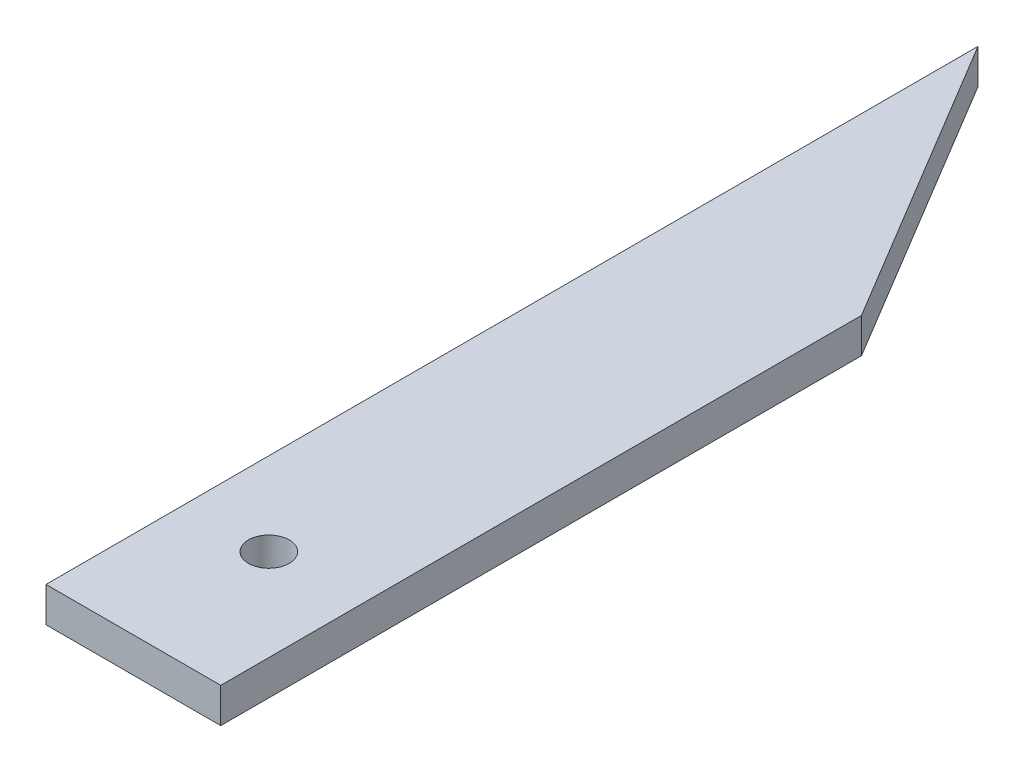
ISO-10303-21;
HEADER;
FILE_DESCRIPTION(('STEP AP214'),'2;1');
FILE_NAME('part.step','',(''),(''),'','','');
FILE_SCHEMA(('AUTOMOTIVE_DESIGN { 1 0 10303 214 1 1 1 1 }'));
ENDSEC;
DATA;
#1=APPLICATION_CONTEXT('core data for automotive mechanical design processes');
#2=APPLICATION_PROTOCOL_DEFINITION('international standard','automotive_design',2000,#1);
#3=PRODUCT_CONTEXT('',#1,'mechanical');
#4=PRODUCT('Part','Part','',(#3));
#5=PRODUCT_RELATED_PRODUCT_CATEGORY('part','',(#4));
#6=PRODUCT_DEFINITION_FORMATION('','',#4);
#7=PRODUCT_DEFINITION_CONTEXT('part definition',#1,'design');
#8=PRODUCT_DEFINITION('design','',#6,#7);
#9=PRODUCT_DEFINITION_SHAPE('','',#8);
#10=(LENGTH_UNIT() NAMED_UNIT(*) SI_UNIT(.MILLI.,.METRE.));
#11=(NAMED_UNIT(*) PLANE_ANGLE_UNIT() SI_UNIT($,.RADIAN.));
#12=(NAMED_UNIT(*) SI_UNIT($,.STERADIAN.) SOLID_ANGLE_UNIT());
#13=UNCERTAINTY_MEASURE_WITH_UNIT(LENGTH_MEASURE(1.E-05),#10,'distance_accuracy_value','');
#14=(GEOMETRIC_REPRESENTATION_CONTEXT(3) GLOBAL_UNCERTAINTY_ASSIGNED_CONTEXT((#13)) GLOBAL_UNIT_ASSIGNED_CONTEXT((#10,
#11,#12)) REPRESENTATION_CONTEXT('',''));
#15=CARTESIAN_POINT('',(0.,0.,0.));
#16=DIRECTION('',(0.,0.,1.));
#17=DIRECTION('',(1.,0.,0.));
#18=AXIS2_PLACEMENT_3D('',#15,#16,#17);
#19=CARTESIAN_POINT('',(0.,3.,0.));
#20=DIRECTION('',(0.,-1.,0.));
#21=DIRECTION('',(0.,0.,-1.));
#22=AXIS2_PLACEMENT_3D('',#19,#20,#21);
#23=PLANE('',#22);
#24=DIRECTION('',(0.,0.,1.));
#25=VECTOR('',#24,1.);
#26=CARTESIAN_POINT('',(-7.12719033156067,3.,41.9883182316764));
#27=LINE('',#26,#25);
#28=CARTESIAN_POINT('',(-7.12719033156067,3.,-38.0116817683236));
#29=VERTEX_POINT('',#28);
#30=CARTESIAN_POINT('',(-7.12719033156067,3.,41.9883182316764));
#31=VERTEX_POINT('',#30);
#32=EDGE_CURVE('E92',#29,#31,#27,.T.);
#33=ORIENTED_EDGE('',*,*,#32,.T.);
#34=DIRECTION('',(1.,0.,0.));
#35=VECTOR('',#34,1.);
#36=CARTESIAN_POINT('',(-7.12719033156067,3.,41.9883182316764));
#37=LINE('',#36,#35);
#38=CARTESIAN_POINT('',(7.87280966843933,3.,41.9883182316764));
#39=VERTEX_POINT('',#38);
#40=EDGE_CURVE('E87',#31,#39,#37,.T.);
#41=ORIENTED_EDGE('',*,*,#40,.T.);
#42=DIRECTION('',(0.,0.,-1.));
#43=VECTOR('',#42,1.);
#44=CARTESIAN_POINT('',(7.87280966843933,3.,41.9883182316764));
#45=LINE('',#44,#43);
#46=CARTESIAN_POINT('',(7.87280966843933,3.,-13.0116817683236));
#47=VERTEX_POINT('',#46);
#48=EDGE_CURVE('E90',#39,#47,#45,.T.);
#49=ORIENTED_EDGE('',*,*,#48,.T.);
#50=DIRECTION('',(-0.514495755427526,0.,-0.857492925712544));
#51=VECTOR('',#50,1.);
#52=CARTESIAN_POINT('',(-7.12719033156067,3.,-38.0116817683236));
#53=LINE('',#52,#51);
#54=EDGE_CURVE('E57',#47,#29,#53,.T.);
#55=ORIENTED_EDGE('',*,*,#54,.T.);
#56=EDGE_LOOP('',(#33,#41,#49,#55));
#57=FACE_BOUND('',#56,.T.);
#58=CARTESIAN_POINT('',(0.,3.,29.9883182316764));
#59=DIRECTION('',(0.,1.,0.));
#60=DIRECTION('',(0.,0.,1.));
#61=AXIS2_PLACEMENT_3D('',#58,#59,#60);
#62=CIRCLE('',#61,1.75);
#63=CARTESIAN_POINT('',(0.,3.,31.7383182316764));
#64=VERTEX_POINT('',#63);
#65=EDGE_CURVE('E112',#64,#64,#62,.T.);
#66=ORIENTED_EDGE('',*,*,#65,.F.);
#67=EDGE_LOOP('',(#66));
#68=FACE_BOUND('',#67,.T.);
#69=ADVANCED_FACE('F39',(#57,#68),#23,.F.);
#70=CARTESIAN_POINT('',(0.,0.,0.));
#71=DIRECTION('',(0.,-1.,0.));
#72=DIRECTION('',(0.,0.,-1.));
#73=AXIS2_PLACEMENT_3D('',#70,#71,#72);
#74=PLANE('',#73);
#75=DIRECTION('',(0.,0.,1.));
#76=VECTOR('',#75,1.);
#77=CARTESIAN_POINT('',(-7.12719033156067,0.,41.9883182316764));
#78=LINE('',#77,#76);
#79=CARTESIAN_POINT('',(-7.12719033156067,0.,-38.0116817683236));
#80=VERTEX_POINT('',#79);
#81=CARTESIAN_POINT('',(-7.12719033156067,0.,41.9883182316764));
#82=VERTEX_POINT('',#81);
#83=EDGE_CURVE('E108',#80,#82,#78,.T.);
#84=ORIENTED_EDGE('',*,*,#83,.F.);
#85=DIRECTION('',(-0.514495755427526,0.,-0.857492925712544));
#86=VECTOR('',#85,1.);
#87=CARTESIAN_POINT('',(-7.12719033156067,0.,-38.0116817683236));
#88=LINE('',#87,#86);
#89=CARTESIAN_POINT('',(7.87280966843933,0.,-13.0116817683236));
#90=VERTEX_POINT('',#89);
#91=EDGE_CURVE('E80',#90,#80,#88,.T.);
#92=ORIENTED_EDGE('',*,*,#91,.F.);
#93=DIRECTION('',(0.,0.,-1.));
#94=VECTOR('',#93,1.);
#95=CARTESIAN_POINT('',(7.87280966843933,0.,41.9883182316764));
#96=LINE('',#95,#94);
#97=CARTESIAN_POINT('',(7.87280966843933,0.,41.9883182316764));
#98=VERTEX_POINT('',#97);
#99=EDGE_CURVE('E74',#98,#90,#96,.T.);
#100=ORIENTED_EDGE('',*,*,#99,.F.);
#101=DIRECTION('',(1.,0.,0.));
#102=VECTOR('',#101,1.);
#103=CARTESIAN_POINT('',(-7.12719033156067,0.,41.9883182316764));
#104=LINE('',#103,#102);
#105=EDGE_CURVE('E97',#82,#98,#104,.T.);
#106=ORIENTED_EDGE('',*,*,#105,.F.);
#107=EDGE_LOOP('',(#84,#92,#100,#106));
#108=FACE_BOUND('',#107,.T.);
#109=CARTESIAN_POINT('',(0.,0.,29.9883182316764));
#110=DIRECTION('',(0.,1.,0.));
#111=DIRECTION('',(0.,0.,1.));
#112=AXIS2_PLACEMENT_3D('',#109,#110,#111);
#113=CIRCLE('',#112,1.75);
#114=CARTESIAN_POINT('',(0.,0.,31.7383182316764));
#115=VERTEX_POINT('',#114);
#116=EDGE_CURVE('E130',#115,#115,#113,.T.);
#117=ORIENTED_EDGE('',*,*,#116,.T.);
#118=EDGE_LOOP('',(#117));
#119=FACE_BOUND('',#118,.T.);
#120=ADVANCED_FACE('F125',(#108,#119),#74,.T.);
#121=CARTESIAN_POINT('',(-7.12719033156067,3.,41.9883182316764));
#122=DIRECTION('',(1.,0.,0.));
#123=DIRECTION('',(0.,0.,-1.));
#124=AXIS2_PLACEMENT_3D('',#121,#122,#123);
#125=PLANE('',#124);
#126=ORIENTED_EDGE('',*,*,#83,.T.);
#127=DIRECTION('',(0.,-1.,0.));
#128=VECTOR('',#127,1.);
#129=CARTESIAN_POINT('',(-7.12719033156067,3.,41.9883182316764));
#130=LINE('',#129,#128);
#131=EDGE_CURVE('E11',#31,#82,#130,.T.);
#132=ORIENTED_EDGE('',*,*,#131,.F.);
#133=ORIENTED_EDGE('',*,*,#32,.F.);
#134=DIRECTION('',(0.,-1.,0.));
#135=VECTOR('',#134,1.);
#136=CARTESIAN_POINT('',(-7.12719033156067,3.,-38.0116817683236));
#137=LINE('',#136,#135);
#138=EDGE_CURVE('E104',#29,#80,#137,.T.);
#139=ORIENTED_EDGE('',*,*,#138,.T.);
#140=EDGE_LOOP('',(#126,#132,#133,#139));
#141=FACE_BOUND('',#140,.T.);
#142=ADVANCED_FACE('F41',(#141),#125,.F.);
#143=CARTESIAN_POINT('',(-7.12719033156067,3.,41.9883182316764));
#144=DIRECTION('',(0.,0.,-1.));
#145=DIRECTION('',(-1.,0.,0.));
#146=AXIS2_PLACEMENT_3D('',#143,#144,#145);
#147=PLANE('',#146);
#148=ORIENTED_EDGE('',*,*,#105,.T.);
#149=DIRECTION('',(0.,-1.,0.));
#150=VECTOR('',#149,1.);
#151=CARTESIAN_POINT('',(7.87280966843933,3.,41.9883182316764));
#152=LINE('',#151,#150);
#153=EDGE_CURVE('E49',#39,#98,#152,.T.);
#154=ORIENTED_EDGE('',*,*,#153,.F.);
#155=ORIENTED_EDGE('',*,*,#40,.F.);
#156=ORIENTED_EDGE('',*,*,#131,.T.);
#157=EDGE_LOOP('',(#148,#154,#155,#156));
#158=FACE_BOUND('',#157,.T.);
#159=ADVANCED_FACE('F96',(#158),#147,.F.);
#160=CARTESIAN_POINT('',(7.87280966843933,3.,41.9883182316764));
#161=DIRECTION('',(-1.,0.,0.));
#162=DIRECTION('',(0.,0.,1.));
#163=AXIS2_PLACEMENT_3D('',#160,#161,#162);
#164=PLANE('',#163);
#165=ORIENTED_EDGE('',*,*,#99,.T.);
#166=DIRECTION('',(0.,-1.,0.));
#167=VECTOR('',#166,1.);
#168=CARTESIAN_POINT('',(7.87280966843933,3.,-13.0116817683236));
#169=LINE('',#168,#167);
#170=EDGE_CURVE('E99',#47,#90,#169,.T.);
#171=ORIENTED_EDGE('',*,*,#170,.F.);
#172=ORIENTED_EDGE('',*,*,#48,.F.);
#173=ORIENTED_EDGE('',*,*,#153,.T.);
#174=EDGE_LOOP('',(#165,#171,#172,#173));
#175=FACE_BOUND('',#174,.T.);
#176=ADVANCED_FACE('F100',(#175),#164,.F.);
#177=CARTESIAN_POINT('',(-7.12719033156067,3.,-38.0116817683236));
#178=DIRECTION('',(-0.857492925712544,0.,0.514495755427527));
#179=DIRECTION('',(0.514495755427527,0.,0.857492925712544));
#180=AXIS2_PLACEMENT_3D('',#177,#178,#179);
#181=PLANE('',#180);
#182=ORIENTED_EDGE('',*,*,#91,.T.);
#183=ORIENTED_EDGE('',*,*,#138,.F.);
#184=ORIENTED_EDGE('',*,*,#54,.F.);
#185=ORIENTED_EDGE('',*,*,#170,.T.);
#186=EDGE_LOOP('',(#182,#183,#184,#185));
#187=FACE_BOUND('',#186,.T.);
#188=ADVANCED_FACE('F122',(#187),#181,.F.);
#189=CARTESIAN_POINT('',(0.,3.,29.9883182316764));
#190=DIRECTION('',(0.,-1.,0.));
#191=DIRECTION('',(0.,0.,-1.));
#192=AXIS2_PLACEMENT_3D('',#189,#190,#191);
#193=CYLINDRICAL_SURFACE('',#192,1.75);
#194=ORIENTED_EDGE('',*,*,#65,.T.);
#195=EDGE_LOOP('',(#194));
#196=FACE_BOUND('',#195,.T.);
#197=ORIENTED_EDGE('',*,*,#116,.F.);
#198=EDGE_LOOP('',(#197));
#199=FACE_BOUND('',#198,.T.);
#200=ADVANCED_FACE('F138',(#196,#199),#193,.F.);
#201=CLOSED_SHELL('',(#69,#120,#142,#159,#176,#188,#200));
#202=MANIFOLD_SOLID_BREP('B2',#201);
#203=ADVANCED_BREP_SHAPE_REPRESENTATION('',(#18,#202),#14);
#204=SHAPE_DEFINITION_REPRESENTATION(#9,#203);
ENDSEC;
END-ISO-10303-21;
